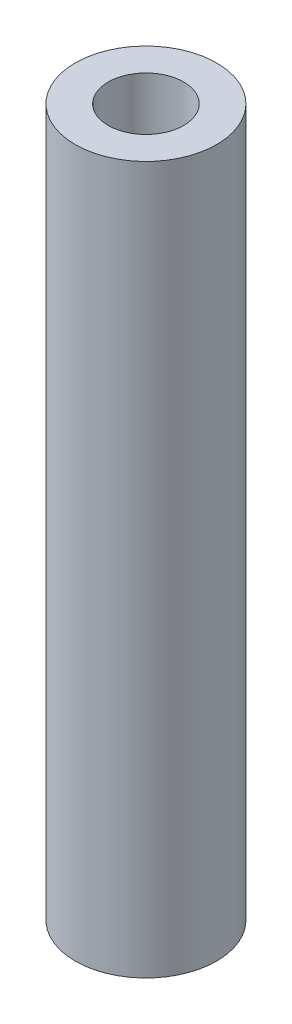
ISO-10303-21;
HEADER;
FILE_DESCRIPTION(('STEP AP214'),'2;1');
FILE_NAME('part.step','',(''),(''),'','','');
FILE_SCHEMA(('AUTOMOTIVE_DESIGN { 1 0 10303 214 1 1 1 1 }'));
ENDSEC;
DATA;
#1=APPLICATION_CONTEXT('core data for automotive mechanical design processes');
#2=APPLICATION_PROTOCOL_DEFINITION('international standard','automotive_design',2000,#1);
#3=PRODUCT_CONTEXT('',#1,'mechanical');
#4=PRODUCT('Part','Part','',(#3));
#5=PRODUCT_RELATED_PRODUCT_CATEGORY('part','',(#4));
#6=PRODUCT_DEFINITION_FORMATION('','',#4);
#7=PRODUCT_DEFINITION_CONTEXT('part definition',#1,'design');
#8=PRODUCT_DEFINITION('design','',#6,#7);
#9=PRODUCT_DEFINITION_SHAPE('','',#8);
#10=(LENGTH_UNIT() NAMED_UNIT(*) SI_UNIT(.MILLI.,.METRE.));
#11=(NAMED_UNIT(*) PLANE_ANGLE_UNIT() SI_UNIT($,.RADIAN.));
#12=(NAMED_UNIT(*) SI_UNIT($,.STERADIAN.) SOLID_ANGLE_UNIT());
#13=UNCERTAINTY_MEASURE_WITH_UNIT(LENGTH_MEASURE(1.E-05),#10,'distance_accuracy_value','');
#14=(GEOMETRIC_REPRESENTATION_CONTEXT(3) GLOBAL_UNCERTAINTY_ASSIGNED_CONTEXT((#13)) GLOBAL_UNIT_ASSIGNED_CONTEXT((#10,
#11,#12)) REPRESENTATION_CONTEXT('',''));
#15=CARTESIAN_POINT('',(0.,0.,0.));
#16=DIRECTION('',(0.,0.,1.));
#17=DIRECTION('',(1.,0.,0.));
#18=AXIS2_PLACEMENT_3D('',#15,#16,#17);
#19=CARTESIAN_POINT('',(0.,30.,0.));
#20=DIRECTION('',(0.,1.,0.));
#21=DIRECTION('',(0.,0.,1.));
#22=AXIS2_PLACEMENT_3D('',#19,#20,#21);
#23=PLANE('',#22);
#24=CARTESIAN_POINT('',(0.,30.,0.));
#25=DIRECTION('',(0.,1.,0.));
#26=DIRECTION('',(0.,0.,1.));
#27=AXIS2_PLACEMENT_3D('',#24,#25,#26);
#28=CIRCLE('',#27,3.);
#29=CARTESIAN_POINT('',(0.,30.,3.));
#30=VERTEX_POINT('',#29);
#31=EDGE_CURVE('E10',#30,#30,#28,.T.);
#32=ORIENTED_EDGE('',*,*,#31,.T.);
#33=EDGE_LOOP('',(#32));
#34=FACE_BOUND('',#33,.T.);
#35=CARTESIAN_POINT('',(0.,30.,0.));
#36=DIRECTION('',(0.,1.,0.));
#37=DIRECTION('',(0.,0.,1.));
#38=AXIS2_PLACEMENT_3D('',#35,#36,#37);
#39=CIRCLE('',#38,1.6);
#40=CARTESIAN_POINT('',(0.,30.,1.6));
#41=VERTEX_POINT('',#40);
#42=EDGE_CURVE('E56',#41,#41,#39,.T.);
#43=ORIENTED_EDGE('',*,*,#42,.F.);
#44=EDGE_LOOP('',(#43));
#45=FACE_BOUND('',#44,.T.);
#46=ADVANCED_FACE('F43',(#34,#45),#23,.T.);
#47=CARTESIAN_POINT('',(0.,0.,0.));
#48=DIRECTION('',(0.,1.,0.));
#49=DIRECTION('',(0.,0.,1.));
#50=AXIS2_PLACEMENT_3D('',#47,#48,#49);
#51=PLANE('',#50);
#52=CARTESIAN_POINT('',(0.,0.,0.));
#53=DIRECTION('',(0.,1.,0.));
#54=DIRECTION('',(0.,0.,1.));
#55=AXIS2_PLACEMENT_3D('',#52,#53,#54);
#56=CIRCLE('',#55,3.);
#57=CARTESIAN_POINT('',(0.,0.,3.));
#58=VERTEX_POINT('',#57);
#59=EDGE_CURVE('E47',#58,#58,#56,.T.);
#60=ORIENTED_EDGE('',*,*,#59,.F.);
#61=EDGE_LOOP('',(#60));
#62=FACE_BOUND('',#61,.T.);
#63=CARTESIAN_POINT('',(0.,0.,0.));
#64=DIRECTION('',(0.,1.,0.));
#65=DIRECTION('',(0.,0.,1.));
#66=AXIS2_PLACEMENT_3D('',#63,#64,#65);
#67=CIRCLE('',#66,1.6);
#68=CARTESIAN_POINT('',(0.,0.,1.6));
#69=VERTEX_POINT('',#68);
#70=EDGE_CURVE('E58',#69,#69,#67,.T.);
#71=ORIENTED_EDGE('',*,*,#70,.T.);
#72=EDGE_LOOP('',(#71));
#73=FACE_BOUND('',#72,.T.);
#74=ADVANCED_FACE('F70',(#62,#73),#51,.F.);
#75=CARTESIAN_POINT('',(0.,30.,0.));
#76=DIRECTION('',(0.,-1.,0.));
#77=DIRECTION('',(0.,0.,-1.));
#78=AXIS2_PLACEMENT_3D('',#75,#76,#77);
#79=CYLINDRICAL_SURFACE('',#78,3.);
#80=ORIENTED_EDGE('',*,*,#31,.F.);
#81=EDGE_LOOP('',(#80));
#82=FACE_BOUND('',#81,.T.);
#83=ORIENTED_EDGE('',*,*,#59,.T.);
#84=EDGE_LOOP('',(#83));
#85=FACE_BOUND('',#84,.T.);
#86=ADVANCED_FACE('F45',(#82,#85),#79,.T.);
#87=CARTESIAN_POINT('',(0.,30.,0.));
#88=DIRECTION('',(0.,-1.,0.));
#89=DIRECTION('',(0.,0.,-1.));
#90=AXIS2_PLACEMENT_3D('',#87,#88,#89);
#91=CYLINDRICAL_SURFACE('',#90,1.6);
#92=ORIENTED_EDGE('',*,*,#42,.T.);
#93=EDGE_LOOP('',(#92));
#94=FACE_BOUND('',#93,.T.);
#95=ORIENTED_EDGE('',*,*,#70,.F.);
#96=EDGE_LOOP('',(#95));
#97=FACE_BOUND('',#96,.T.);
#98=ADVANCED_FACE('F66',(#94,#97),#91,.F.);
#99=CLOSED_SHELL('',(#46,#74,#86,#98));
#100=MANIFOLD_SOLID_BREP('B2',#99);
#101=ADVANCED_BREP_SHAPE_REPRESENTATION('',(#18,#100),#14);
#102=SHAPE_DEFINITION_REPRESENTATION(#9,#101);
ENDSEC;
END-ISO-10303-21;
